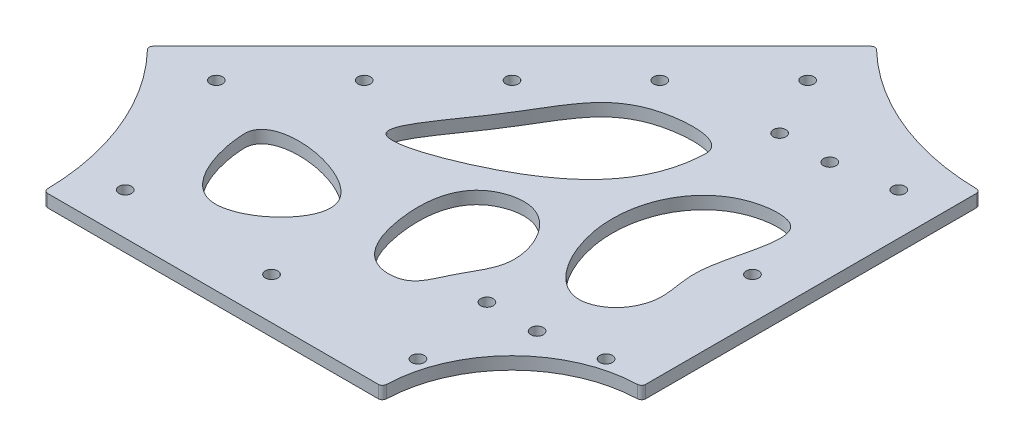
ISO-10303-21;
HEADER;
FILE_DESCRIPTION(('STEP AP214'),'2;1');
FILE_NAME('part.step','',(''),(''),'','','');
FILE_SCHEMA(('AUTOMOTIVE_DESIGN { 1 0 10303 214 1 1 1 1 }'));
ENDSEC;
DATA;
#1=APPLICATION_CONTEXT('core data for automotive mechanical design processes');
#2=APPLICATION_PROTOCOL_DEFINITION('international standard','automotive_design',2000,#1);
#3=PRODUCT_CONTEXT('',#1,'mechanical');
#4=PRODUCT('Part','Part','',(#3));
#5=PRODUCT_RELATED_PRODUCT_CATEGORY('part','',(#4));
#6=PRODUCT_DEFINITION_FORMATION('','',#4);
#7=PRODUCT_DEFINITION_CONTEXT('part definition',#1,'design');
#8=PRODUCT_DEFINITION('design','',#6,#7);
#9=PRODUCT_DEFINITION_SHAPE('','',#8);
#10=(LENGTH_UNIT() NAMED_UNIT(*) SI_UNIT(.MILLI.,.METRE.));
#11=(NAMED_UNIT(*) PLANE_ANGLE_UNIT() SI_UNIT($,.RADIAN.));
#12=(NAMED_UNIT(*) SI_UNIT($,.STERADIAN.) SOLID_ANGLE_UNIT());
#13=UNCERTAINTY_MEASURE_WITH_UNIT(LENGTH_MEASURE(1.E-05),#10,'distance_accuracy_value','');
#14=(GEOMETRIC_REPRESENTATION_CONTEXT(3) GLOBAL_UNCERTAINTY_ASSIGNED_CONTEXT((#13)) GLOBAL_UNIT_ASSIGNED_CONTEXT((#10,
#11,#12)) REPRESENTATION_CONTEXT('',''));
#15=CARTESIAN_POINT('',(0.,0.,0.));
#16=DIRECTION('',(0.,0.,1.));
#17=DIRECTION('',(1.,0.,0.));
#18=AXIS2_PLACEMENT_3D('',#15,#16,#17);
#19=CARTESIAN_POINT('',(-24.142135623731,3.,10.));
#20=DIRECTION('',(0.,0.,-1.));
#21=DIRECTION('',(-1.,0.,0.));
#22=AXIS2_PLACEMENT_3D('',#19,#20,#21);
#23=PLANE('',#22);
#24=DIRECTION('',(1.,0.,0.));
#25=VECTOR('',#24,1.);
#26=CARTESIAN_POINT('',(-24.142135623731,3.,10.));
#27=LINE('',#26,#25);
#28=CARTESIAN_POINT('',(36.8496671041767,3.,10.));
#29=VERTEX_POINT('',#28);
#30=CARTESIAN_POINT('',(115.901451147938,3.,10.));
#31=VERTEX_POINT('',#30);
#32=EDGE_CURVE('E155',#29,#31,#27,.T.);
#33=ORIENTED_EDGE('',*,*,#32,.F.);
#34=DIRECTION('',(0.,1.,0.));
#35=VECTOR('',#34,1.);
#36=CARTESIAN_POINT('',(36.8496671041767,3.,10.));
#37=LINE('',#36,#35);
#38=CARTESIAN_POINT('',(36.8496671041767,0.,10.));
#39=VERTEX_POINT('',#38);
#40=EDGE_CURVE('E196',#29,#39,#37,.F.);
#41=ORIENTED_EDGE('',*,*,#40,.T.);
#42=DIRECTION('',(1.,0.,0.));
#43=VECTOR('',#42,1.);
#44=CARTESIAN_POINT('',(-24.142135623731,0.,10.));
#45=LINE('',#44,#43);
#46=CARTESIAN_POINT('',(115.901451147938,0.,10.));
#47=VERTEX_POINT('',#46);
#48=EDGE_CURVE('E152',#39,#47,#45,.T.);
#49=ORIENTED_EDGE('',*,*,#48,.T.);
#50=DIRECTION('',(0.,1.,0.));
#51=VECTOR('',#50,1.);
#52=CARTESIAN_POINT('',(115.901451147938,3.,10.));
#53=LINE('',#52,#51);
#54=EDGE_CURVE('E193',#47,#31,#53,.T.);
#55=ORIENTED_EDGE('',*,*,#54,.T.);
#56=EDGE_LOOP('',(#33,#41,#49,#55));
#57=FACE_BOUND('',#56,.T.);
#58=ADVANCED_FACE('F35',(#57),#23,.F.);
#59=CARTESIAN_POINT('',(147.885822331377,3.,10.));
#60=DIRECTION('',(-1.,0.,0.));
#61=DIRECTION('',(0.,0.,1.));
#62=AXIS2_PLACEMENT_3D('',#59,#60,#61);
#63=PLANE('',#62);
#64=DIRECTION('',(0.,0.,-1.));
#65=VECTOR('',#64,1.);
#66=CARTESIAN_POINT('',(147.885822331377,0.,10.));
#67=LINE('',#66,#65);
#68=CARTESIAN_POINT('',(147.885822331377,0.,-21.9843711834389));
#69=VERTEX_POINT('',#68);
#70=CARTESIAN_POINT('',(147.885822331377,0.,-101.0361552272));
#71=VERTEX_POINT('',#70);
#72=EDGE_CURVE('E140',#69,#71,#67,.T.);
#73=ORIENTED_EDGE('',*,*,#72,.T.);
#74=DIRECTION('',(0.,1.,0.));
#75=VECTOR('',#74,1.);
#76=CARTESIAN_POINT('',(147.885822331377,3.,-101.0361552272));
#77=LINE('',#76,#75);
#78=CARTESIAN_POINT('',(147.885822331377,3.,-101.0361552272));
#79=VERTEX_POINT('',#78);
#80=EDGE_CURVE('E144',#71,#79,#77,.T.);
#81=ORIENTED_EDGE('',*,*,#80,.T.);
#82=DIRECTION('',(0.,0.,-1.));
#83=VECTOR('',#82,1.);
#84=CARTESIAN_POINT('',(147.885822331377,3.,10.));
#85=LINE('',#84,#83);
#86=CARTESIAN_POINT('',(147.885822331377,3.,-21.9843711834389));
#87=VERTEX_POINT('',#86);
#88=EDGE_CURVE('E143',#87,#79,#85,.T.);
#89=ORIENTED_EDGE('',*,*,#88,.F.);
#90=DIRECTION('',(0.,1.,0.));
#91=VECTOR('',#90,1.);
#92=CARTESIAN_POINT('',(147.885822331377,3.,-21.9843711834389));
#93=LINE('',#92,#91);
#94=EDGE_CURVE('E128',#87,#69,#93,.F.);
#95=ORIENTED_EDGE('',*,*,#94,.T.);
#96=EDGE_LOOP('',(#73,#81,#89,#95));
#97=FACE_BOUND('',#96,.T.);
#98=ADVANCED_FACE('F138',(#97),#63,.F.);
#99=CARTESIAN_POINT('',(-24.142135623731,3.,10.));
#100=DIRECTION('',(0.707106781186547,0.,0.707106781186547));
#101=DIRECTION('',(0.707106781186548,0.,-0.707106781186548));
#102=AXIS2_PLACEMENT_3D('',#99,#100,#101);
#103=PLANE('',#102);
#104=DIRECTION('',(-0.707106781186548,0.,0.707106781186548));
#105=VECTOR('',#104,1.);
#106=CARTESIAN_POINT('',(-24.142135623731,3.,10.));
#107=LINE('',#106,#105);
#108=CARTESIAN_POINT('',(104.758105025681,3.,-118.900240649412));
#109=VERTEX_POINT('',#108);
#110=CARTESIAN_POINT('',(18.9855816819647,3.,-33.1277173056956));
#111=VERTEX_POINT('',#110);
#112=EDGE_CURVE('E162',#109,#111,#107,.T.);
#113=ORIENTED_EDGE('',*,*,#112,.F.);
#114=DIRECTION('',(0.,1.,0.));
#115=VECTOR('',#114,1.);
#116=CARTESIAN_POINT('',(104.758105025681,3.,-118.900240649412));
#117=LINE('',#116,#115);
#118=CARTESIAN_POINT('',(104.758105025681,0.,-118.900240649412));
#119=VERTEX_POINT('',#118);
#120=EDGE_CURVE('E190',#109,#119,#117,.F.);
#121=ORIENTED_EDGE('',*,*,#120,.T.);
#122=DIRECTION('',(-0.707106781186548,0.,0.707106781186548));
#123=VECTOR('',#122,1.);
#124=CARTESIAN_POINT('',(-24.142135623731,0.,10.));
#125=LINE('',#124,#123);
#126=CARTESIAN_POINT('',(18.9855816819647,0.,-33.1277173056956));
#127=VERTEX_POINT('',#126);
#128=EDGE_CURVE('E151',#119,#127,#125,.T.);
#129=ORIENTED_EDGE('',*,*,#128,.T.);
#130=DIRECTION('',(0.,1.,0.));
#131=VECTOR('',#130,1.);
#132=CARTESIAN_POINT('',(18.9855816819647,3.,-33.1277173056956));
#133=LINE('',#132,#131);
#134=EDGE_CURVE('E187',#127,#111,#133,.T.);
#135=ORIENTED_EDGE('',*,*,#134,.T.);
#136=EDGE_LOOP('',(#113,#121,#129,#135));
#137=FACE_BOUND('',#136,.T.);
#138=ADVANCED_FACE('F230',(#137),#103,.F.);
#139=CARTESIAN_POINT('',(0.,3.,0.));
#140=DIRECTION('',(0.,1.,0.));
#141=DIRECTION('',(0.,0.,1.));
#142=AXIS2_PLACEMENT_3D('',#139,#140,#141);
#143=PLANE('',#142);
#144=CARTESIAN_POINT('',(48.0207708751559,3.,-26.5380031517667));
#145=CARTESIAN_POINT('',(47.9589380150706,3.,-26.0324703958686));
#146=CARTESIAN_POINT('',(48.2417406627143,3.,-18.7176820810887));
#147=CARTESIAN_POINT('',(55.3857149417099,3.,1.39028527395019));
#148=CARTESIAN_POINT('',(88.3338671294946,3.,-27.3294698025201));
#149=CARTESIAN_POINT('',(48.9933759244344,3.,-34.4898221406404));
#150=CARTESIAN_POINT('',(48.0207708751559,3.,-26.5380031517667));
#151=B_SPLINE_CURVE_WITH_KNOTS('',3,(#144,#145,#146,#147,#148,#149,#150),.UNSPECIFIED.,.T.,.F.,
(4,1,1,1,4),(0.,0.0238617420393639,0.315324429022035,0.62466476950808,1.),.UNSPECIFIED.);
#152=CARTESIAN_POINT('',(48.0207708751559,3.,-26.5380031517667));
#153=VERTEX_POINT('',#152);
#154=EDGE_CURVE('E311',#153,#153,#151,.T.);
#155=ORIENTED_EDGE('',*,*,#154,.F.);
#156=EDGE_LOOP('',(#155));
#157=FACE_BOUND('',#156,.T.);
#158=CARTESIAN_POINT('',(110.008057919536,3.,-47.5424894786678));
#159=CARTESIAN_POINT('',(111.489833592235,3.,-39.2434784078382));
#160=CARTESIAN_POINT('',(118.20161406506,3.,-28.622441594674));
#161=CARTESIAN_POINT('',(129.148102504398,3.,-33.9272325353464));
#162=CARTESIAN_POINT('',(132.873326016814,3.,-41.5995162160901));
#163=CARTESIAN_POINT('',(128.223189281434,3.,-53.7391117008643));
#164=CARTESIAN_POINT('',(138.835243286505,3.,-73.9172414331117));
#165=CARTESIAN_POINT('',(114.902579525797,3.,-73.0151046379616));
#166=CARTESIAN_POINT('',(107.962638199714,3.,-58.9983131988496));
#167=CARTESIAN_POINT('',(110.008057919536,3.,-47.5424894786678));
#168=B_SPLINE_CURVE_WITH_KNOTS('',3,(#158,#159,#160,#161,#162,#163,#164,#165,#166,#167),
.UNSPECIFIED.,.T.,.F.,(4,1,1,1,1,1,1,4),(0.,0.203400882189778,0.252548794532999,
0.328655402043644,0.427644221375782,0.641239676770633,0.719228636881117,1.),.UNSPECIFIED.);
#169=CARTESIAN_POINT('',(110.008057919536,3.,-47.5424894786678));
#170=VERTEX_POINT('',#169);
#171=EDGE_CURVE('E330',#170,#170,#168,.T.);
#172=ORIENTED_EDGE('',*,*,#171,.F.);
#173=EDGE_LOOP('',(#172));
#174=FACE_BOUND('',#173,.T.);
#175=CARTESIAN_POINT('',(88.2604406907473,3.,-42.6926426949315));
#176=CARTESIAN_POINT('',(84.0615771036215,3.,-39.2650824081983));
#177=CARTESIAN_POINT('',(82.780161964088,3.,-27.5588647487042));
#178=CARTESIAN_POINT('',(88.002608571192,3.,-13.5928161103983));
#179=CARTESIAN_POINT('',(99.2211157214691,3.,-14.151818351598));
#180=CARTESIAN_POINT('',(102.059809278584,3.,-22.5705701118098));
#181=CARTESIAN_POINT('',(109.056863231587,3.,-31.6477895194941));
#182=CARTESIAN_POINT('',(101.312029856873,3.,-47.6269058760816));
#183=CARTESIAN_POINT('',(90.8944301674383,3.,-44.842785832151));
#184=CARTESIAN_POINT('',(88.2604406907473,3.,-42.6926426949315));
#185=B_SPLINE_CURVE_WITH_KNOTS('',3,(#175,#176,#177,#178,#179,#180,#181,#182,#183,#184),
.UNSPECIFIED.,.T.,.F.,(4,1,1,1,1,1,1,4),(0.,0.20020163156701,0.380411687288089,
0.454336448949224,0.547770151120612,0.674620485174556,0.874411497344012,1.),.UNSPECIFIED.);
#186=CARTESIAN_POINT('',(88.2604406907473,3.,-42.6926426949315));
#187=VERTEX_POINT('',#186);
#188=EDGE_CURVE('E312',#187,#187,#185,.T.);
#189=ORIENTED_EDGE('',*,*,#188,.F.);
#190=EDGE_LOOP('',(#189));
#191=FACE_BOUND('',#190,.T.);
#192=CARTESIAN_POINT('',(107.258933635174,3.,-77.3439365042997));
#193=CARTESIAN_POINT('',(106.861115496115,3.,-81.4499527020187));
#194=CARTESIAN_POINT('',(84.1430807750505,3.,-81.6117622461612));
#195=CARTESIAN_POINT('',(79.1212888398042,3.,-64.9228780353873));
#196=CARTESIAN_POINT('',(56.6410949038031,3.,-37.2502898617927));
#197=CARTESIAN_POINT('',(94.5137998700881,3.,-50.1673077245055));
#198=CARTESIAN_POINT('',(106.828330692644,3.,-64.1568131094747));
#199=CARTESIAN_POINT('',(107.292522099081,3.,-76.9972585544591));
#200=CARTESIAN_POINT('',(107.258933635174,3.,-77.3439365042997));
#201=B_SPLINE_CURVE_WITH_KNOTS('',3,(#192,#193,#194,#195,#196,#197,#198,#199,#200),
.UNSPECIFIED.,.T.,.F.,(4,1,1,1,1,1,4),(0.,0.108879833934048,0.352646080529844,0.515155306572242,
0.685720332886159,0.990807089940803,1.),.UNSPECIFIED.);
#202=CARTESIAN_POINT('',(107.258933635174,3.,-77.3439365042997));
#203=VERTEX_POINT('',#202);
#204=EDGE_CURVE('E310',#203,#203,#201,.T.);
#205=ORIENTED_EDGE('',*,*,#204,.F.);
#206=EDGE_LOOP('',(#205));
#207=FACE_BOUND('',#206,.T.);
#208=CARTESIAN_POINT('',(137.885822331377,3.,-22.5));
#209=DIRECTION('',(0.,1.,0.));
#210=DIRECTION('',(0.,0.,-1.));
#211=AXIS2_PLACEMENT_3D('',#208,#209,#210);
#212=CIRCLE('',#211,1.5);
#213=CARTESIAN_POINT('',(137.885822331377,3.,-24.));
#214=VERTEX_POINT('',#213);
#215=EDGE_CURVE('E695',#214,#214,#212,.T.);
#216=ORIENTED_EDGE('',*,*,#215,.F.);
#217=EDGE_LOOP('',(#216));
#218=FACE_BOUND('',#217,.T.);
#219=CARTESIAN_POINT('',(104.298250225016,3.,-104.298250225016));
#220=DIRECTION('',(0.,1.,0.));
#221=DIRECTION('',(0.,0.,1.));
#222=AXIS2_PLACEMENT_3D('',#219,#220,#221);
#223=CIRCLE('',#222,1.50000000000001);
#224=CARTESIAN_POINT('',(104.298250225016,3.,-102.798250225016));
#225=VERTEX_POINT('',#224);
#226=EDGE_CURVE('E726',#225,#225,#223,.T.);
#227=ORIENTED_EDGE('',*,*,#226,.F.);
#228=EDGE_LOOP('',(#227));
#229=FACE_BOUND('',#228,.T.);
#230=CARTESIAN_POINT('',(86.620580695352,3.,-86.620580695352));
#231=DIRECTION('',(0.,1.,0.));
#232=DIRECTION('',(0.,0.,1.));
#233=AXIS2_PLACEMENT_3D('',#230,#231,#232);
#234=CIRCLE('',#233,1.50000000000001);
#235=CARTESIAN_POINT('',(86.620580695352,3.,-85.120580695352));
#236=VERTEX_POINT('',#235);
#237=EDGE_CURVE('E722',#236,#236,#234,.T.);
#238=ORIENTED_EDGE('',*,*,#237,.F.);
#239=EDGE_LOOP('',(#238));
#240=FACE_BOUND('',#239,.T.);
#241=CARTESIAN_POINT('',(68.9429111656883,3.,-68.9429111656883));
#242=DIRECTION('',(0.,1.,0.));
#243=DIRECTION('',(0.,0.,1.));
#244=AXIS2_PLACEMENT_3D('',#241,#242,#243);
#245=CIRCLE('',#244,1.50000000000001);
#246=CARTESIAN_POINT('',(68.9429111656883,3.,-67.4429111656883));
#247=VERTEX_POINT('',#246);
#248=EDGE_CURVE('E718',#247,#247,#245,.T.);
#249=ORIENTED_EDGE('',*,*,#248,.F.);
#250=EDGE_LOOP('',(#249));
#251=FACE_BOUND('',#250,.T.);
#252=CARTESIAN_POINT('',(51.2652416360246,3.,-51.2652416360247));
#253=DIRECTION('',(0.,1.,0.));
#254=DIRECTION('',(0.,0.,1.));
#255=AXIS2_PLACEMENT_3D('',#252,#253,#254);
#256=CIRCLE('',#255,1.50000000000001);
#257=CARTESIAN_POINT('',(51.2652416360246,3.,-49.7652416360247));
#258=VERTEX_POINT('',#257);
#259=EDGE_CURVE('E253',#258,#258,#256,.T.);
#260=ORIENTED_EDGE('',*,*,#259,.F.);
#261=EDGE_LOOP('',(#260));
#262=FACE_BOUND('',#261,.T.);
#263=CARTESIAN_POINT('',(33.5875721063609,3.,-33.587572106361));
#264=DIRECTION('',(0.,1.,0.));
#265=DIRECTION('',(0.,0.,1.));
#266=AXIS2_PLACEMENT_3D('',#263,#264,#265);
#267=CIRCLE('',#266,1.5);
#268=CARTESIAN_POINT('',(33.5875721063609,3.,-32.087572106361));
#269=VERTEX_POINT('',#268);
#270=EDGE_CURVE('E739',#269,#269,#267,.T.);
#271=ORIENTED_EDGE('',*,*,#270,.F.);
#272=EDGE_LOOP('',(#271));
#273=FACE_BOUND('',#272,.T.);
#274=CARTESIAN_POINT('',(45.3858223313768,3.,4.92276834389992E-13));
#275=DIRECTION('',(0.,1.,0.));
#276=DIRECTION('',(0.,0.,1.));
#277=AXIS2_PLACEMENT_3D('',#274,#275,#276);
#278=CIRCLE('',#277,1.5);
#279=CARTESIAN_POINT('',(45.3858223313768,3.,1.50000000000049));
#280=VERTEX_POINT('',#279);
#281=EDGE_CURVE('E735',#280,#280,#278,.T.);
#282=ORIENTED_EDGE('',*,*,#281,.F.);
#283=EDGE_LOOP('',(#282));
#284=FACE_BOUND('',#283,.T.);
#285=CARTESIAN_POINT('',(80.3858223313768,3.,2.47873140670973E-13));
#286=DIRECTION('',(0.,1.,0.));
#287=DIRECTION('',(0.,0.,1.));
#288=AXIS2_PLACEMENT_3D('',#285,#286,#287);
#289=CIRCLE('',#288,1.5);
#290=CARTESIAN_POINT('',(80.3858223313768,3.,1.50000000000025));
#291=VERTEX_POINT('',#290);
#292=EDGE_CURVE('E731',#291,#291,#289,.T.);
#293=ORIENTED_EDGE('',*,*,#292,.F.);
#294=EDGE_LOOP('',(#293));
#295=FACE_BOUND('',#294,.T.);
#296=CARTESIAN_POINT('',(123.885822331377,3.,-20.));
#297=DIRECTION('',(0.,1.,0.));
#298=DIRECTION('',(0.,0.,-1.));
#299=AXIS2_PLACEMENT_3D('',#296,#297,#298);
#300=CIRCLE('',#299,1.50000000000001);
#301=CARTESIAN_POINT('',(123.885822331377,3.,-21.5));
#302=VERTEX_POINT('',#301);
#303=EDGE_CURVE('E348',#302,#302,#300,.T.);
#304=ORIENTED_EDGE('',*,*,#303,.F.);
#305=EDGE_LOOP('',(#304));
#306=FACE_BOUND('',#305,.T.);
#307=CARTESIAN_POINT('',(123.885822331377,3.,-90.));
#308=DIRECTION('',(0.,1.,0.));
#309=DIRECTION('',(0.,0.,-1.));
#310=AXIS2_PLACEMENT_3D('',#307,#308,#309);
#311=CIRCLE('',#310,1.49999999999999);
#312=CARTESIAN_POINT('',(123.885822331377,3.,-91.5));
#313=VERTEX_POINT('',#312);
#314=EDGE_CURVE('E758',#313,#313,#311,.T.);
#315=ORIENTED_EDGE('',*,*,#314,.F.);
#316=EDGE_LOOP('',(#315));
#317=FACE_BOUND('',#316,.T.);
#318=CARTESIAN_POINT('',(111.885822331377,3.,-20.));
#319=DIRECTION('',(0.,1.,0.));
#320=DIRECTION('',(0.,0.,1.));
#321=AXIS2_PLACEMENT_3D('',#318,#319,#320);
#322=CIRCLE('',#321,1.5);
#323=CARTESIAN_POINT('',(111.885822331377,3.,-18.5));
#324=VERTEX_POINT('',#323);
#325=EDGE_CURVE('E714',#324,#324,#322,.T.);
#326=ORIENTED_EDGE('',*,*,#325,.F.);
#327=EDGE_LOOP('',(#326));
#328=FACE_BOUND('',#327,.T.);
#329=CARTESIAN_POINT('',(111.885822331377,3.,-90.));
#330=DIRECTION('',(0.,1.,0.));
#331=DIRECTION('',(0.,0.,1.));
#332=AXIS2_PLACEMENT_3D('',#329,#330,#331);
#333=CIRCLE('',#332,1.5);
#334=CARTESIAN_POINT('',(111.885822331377,3.,-88.5));
#335=VERTEX_POINT('',#334);
#336=EDGE_CURVE('E710',#335,#335,#333,.T.);
#337=ORIENTED_EDGE('',*,*,#336,.F.);
#338=EDGE_LOOP('',(#337));
#339=FACE_BOUND('',#338,.T.);
#340=CARTESIAN_POINT('',(137.885822331377,3.,-92.5));
#341=DIRECTION('',(0.,1.,0.));
#342=DIRECTION('',(0.,0.,-1.));
#343=AXIS2_PLACEMENT_3D('',#340,#341,#342);
#344=CIRCLE('',#343,1.50000000000002);
#345=CARTESIAN_POINT('',(137.885822331377,3.,-94.0000000000001));
#346=VERTEX_POINT('',#345);
#347=EDGE_CURVE('E706',#346,#346,#344,.T.);
#348=ORIENTED_EDGE('',*,*,#347,.F.);
#349=EDGE_LOOP('',(#348));
#350=FACE_BOUND('',#349,.T.);
#351=CARTESIAN_POINT('',(137.885822331377,3.,-57.5));
#352=DIRECTION('',(0.,1.,0.));
#353=DIRECTION('',(0.,0.,-1.));
#354=AXIS2_PLACEMENT_3D('',#351,#352,#353);
#355=CIRCLE('',#354,1.50000000000001);
#356=CARTESIAN_POINT('',(137.885822331377,3.,-59.));
#357=VERTEX_POINT('',#356);
#358=EDGE_CURVE('E696',#357,#357,#355,.T.);
#359=ORIENTED_EDGE('',*,*,#358,.F.);
#360=EDGE_LOOP('',(#359));
#361=FACE_BOUND('',#360,.T.);
#362=CARTESIAN_POINT('',(115.385822331377,3.,0.));
#363=DIRECTION('',(0.,1.,0.));
#364=DIRECTION('',(0.,0.,1.));
#365=AXIS2_PLACEMENT_3D('',#362,#363,#364);
#366=CIRCLE('',#365,1.5);
#367=CARTESIAN_POINT('',(115.385822331377,3.,1.5));
#368=VERTEX_POINT('',#367);
#369=EDGE_CURVE('E245',#368,#368,#366,.T.);
#370=ORIENTED_EDGE('',*,*,#369,.F.);
#371=EDGE_LOOP('',(#370));
#372=FACE_BOUND('',#371,.T.);
#373=ORIENTED_EDGE('',*,*,#88,.T.);
#374=CARTESIAN_POINT('',(146.885822331377,3.,-101.0361552272));
#375=DIRECTION('',(0.,1.,0.));
#376=DIRECTION('',(0.,0.,1.));
#377=AXIS2_PLACEMENT_3D('',#374,#375,#376);
#378=CIRCLE('',#377,1.);
#379=CARTESIAN_POINT('',(146.902215774,3.,-102.03602084569));
#380=VERTEX_POINT('',#379);
#381=EDGE_CURVE('E175',#79,#380,#378,.T.);
#382=ORIENTED_EDGE('',*,*,#381,.T.);
#383=CARTESIAN_POINT('',(147.885822331377,3.,-162.027957955108));
#384=DIRECTION('',(0.,1.,0.));
#385=DIRECTION('',(0.,0.,1.));
#386=AXIS2_PLACEMENT_3D('',#383,#384,#385);
#387=CIRCLE('',#386,60.);
#388=CARTESIAN_POINT('',(106.160631651532,3.,-118.911737541781));
#389=VERTEX_POINT('',#388);
#390=EDGE_CURVE('E158',#389,#380,#387,.T.);
#391=ORIENTED_EDGE('',*,*,#390,.F.);
#392=CARTESIAN_POINT('',(105.465211806868,3.,-118.193133868226));
#393=DIRECTION('',(0.,1.,0.));
#394=DIRECTION('',(0.,0.,1.));
#395=AXIS2_PLACEMENT_3D('',#392,#393,#394);
#396=CIRCLE('',#395,1.);
#397=EDGE_CURVE('E173',#389,#109,#396,.T.);
#398=ORIENTED_EDGE('',*,*,#397,.T.);
#399=ORIENTED_EDGE('',*,*,#112,.T.);
#400=CARTESIAN_POINT('',(19.6926884631512,3.,-32.4206105245091));
#401=DIRECTION('',(0.,1.,0.));
#402=DIRECTION('',(0.,0.,1.));
#403=AXIS2_PLACEMENT_3D('',#400,#401,#402);
#404=CIRCLE('',#403,1.);
#405=CARTESIAN_POINT('',(18.9740847895958,3.,-31.725190679845));
#406=VERTEX_POINT('',#405);
#407=EDGE_CURVE('E169',#111,#406,#404,.T.);
#408=ORIENTED_EDGE('',*,*,#407,.T.);
#409=CARTESIAN_POINT('',(-24.142135623731,3.,10.));
#410=DIRECTION('',(0.,1.,0.));
#411=DIRECTION('',(0.,0.,1.));
#412=AXIS2_PLACEMENT_3D('',#409,#410,#411);
#413=CIRCLE('',#412,60.);
#414=CARTESIAN_POINT('',(35.8498014856864,3.,9.01639344262295));
#415=VERTEX_POINT('',#414);
#416=EDGE_CURVE('E210',#415,#406,#413,.T.);
#417=ORIENTED_EDGE('',*,*,#416,.F.);
#418=CARTESIAN_POINT('',(36.8496671041767,3.,9.));
#419=DIRECTION('',(0.,1.,0.));
#420=DIRECTION('',(0.,0.,1.));
#421=AXIS2_PLACEMENT_3D('',#418,#419,#420);
#422=CIRCLE('',#421,1.);
#423=EDGE_CURVE('E171',#415,#29,#422,.T.);
#424=ORIENTED_EDGE('',*,*,#423,.T.);
#425=ORIENTED_EDGE('',*,*,#32,.T.);
#426=CARTESIAN_POINT('',(115.901451147938,3.,9.));
#427=DIRECTION('',(0.,1.,0.));
#428=DIRECTION('',(0.,0.,1.));
#429=AXIS2_PLACEMENT_3D('',#426,#427,#428);
#430=CIRCLE('',#429,1.);
#431=CARTESIAN_POINT('',(116.90096274742,3.,9.03125));
#432=VERTEX_POINT('',#431);
#433=EDGE_CURVE('E165',#31,#432,#430,.T.);
#434=ORIENTED_EDGE('',*,*,#433,.T.);
#435=CARTESIAN_POINT('',(147.885822331377,3.,10.));
#436=DIRECTION('',(0.,1.,0.));
#437=DIRECTION('',(0.,0.,1.));
#438=AXIS2_PLACEMENT_3D('',#435,#436,#437);
#439=CIRCLE('',#438,31.);
#440=CARTESIAN_POINT('',(146.917072331377,3.,-20.9848595839565));
#441=VERTEX_POINT('',#440);
#442=EDGE_CURVE('E207',#441,#432,#439,.T.);
#443=ORIENTED_EDGE('',*,*,#442,.F.);
#444=CARTESIAN_POINT('',(146.885822331377,3.,-21.9843711834389));
#445=DIRECTION('',(0.,1.,0.));
#446=DIRECTION('',(0.,0.,1.));
#447=AXIS2_PLACEMENT_3D('',#444,#445,#446);
#448=CIRCLE('',#447,1.);
#449=EDGE_CURVE('E167',#441,#87,#448,.T.);
#450=ORIENTED_EDGE('',*,*,#449,.T.);
#451=EDGE_LOOP('',(#373,#382,#391,#398,#399,#408,#417,#424,#425,#434,#443,#450));
#452=FACE_BOUND('',#451,.T.);
#453=ADVANCED_FACE('F218',(#157,#174,#191,#207,#218,#229,#240,#251,#262,#273,#284,#295,#306,
#317,#328,#339,#350,#361,#372,#452),#143,.T.);
#454=CARTESIAN_POINT('',(0.,0.,0.));
#455=DIRECTION('',(0.,1.,0.));
#456=DIRECTION('',(0.,0.,1.));
#457=AXIS2_PLACEMENT_3D('',#454,#455,#456);
#458=PLANE('',#457);
#459=CARTESIAN_POINT('',(48.0207708751559,0.,-26.5380031517667));
#460=CARTESIAN_POINT('',(47.9589380150706,0.,-26.0324703958686));
#461=CARTESIAN_POINT('',(48.2417406627143,0.,-18.7176820810887));
#462=CARTESIAN_POINT('',(55.3857149417099,0.,1.39028527395019));
#463=CARTESIAN_POINT('',(88.3338671294946,0.,-27.3294698025201));
#464=CARTESIAN_POINT('',(48.9933759244344,0.,-34.4898221406404));
#465=CARTESIAN_POINT('',(48.0207708751559,0.,-26.5380031517667));
#466=B_SPLINE_CURVE_WITH_KNOTS('',3,(#459,#460,#461,#462,#463,#464,#465),.UNSPECIFIED.,.T.,.F.,
(4,1,1,1,4),(0.,0.0238617420393639,0.315324429022035,0.62466476950808,1.),.UNSPECIFIED.);
#467=CARTESIAN_POINT('',(48.0207708751559,0.,-26.5380031517667));
#468=VERTEX_POINT('',#467);
#469=EDGE_CURVE('E303',#468,#468,#466,.T.);
#470=ORIENTED_EDGE('',*,*,#469,.T.);
#471=EDGE_LOOP('',(#470));
#472=FACE_BOUND('',#471,.T.);
#473=CARTESIAN_POINT('',(110.008057919536,0.,-47.5424894786678));
#474=CARTESIAN_POINT('',(111.489833592235,0.,-39.2434784078382));
#475=CARTESIAN_POINT('',(118.20161406506,0.,-28.622441594674));
#476=CARTESIAN_POINT('',(129.148102504398,0.,-33.9272325353464));
#477=CARTESIAN_POINT('',(132.873326016814,0.,-41.5995162160901));
#478=CARTESIAN_POINT('',(128.223189281434,0.,-53.7391117008643));
#479=CARTESIAN_POINT('',(138.835243286505,0.,-73.9172414331117));
#480=CARTESIAN_POINT('',(114.902579525797,0.,-73.0151046379616));
#481=CARTESIAN_POINT('',(107.962638199714,0.,-58.9983131988496));
#482=CARTESIAN_POINT('',(110.008057919536,0.,-47.5424894786678));
#483=B_SPLINE_CURVE_WITH_KNOTS('',3,(#473,#474,#475,#476,#477,#478,#479,#480,#481,#482),
.UNSPECIFIED.,.T.,.F.,(4,1,1,1,1,1,1,4),(0.,0.203400882189778,0.252548794532999,
0.328655402043644,0.427644221375782,0.641239676770633,0.719228636881117,1.),.UNSPECIFIED.);
#484=CARTESIAN_POINT('',(110.008057919536,0.,-47.5424894786678));
#485=VERTEX_POINT('',#484);
#486=EDGE_CURVE('E321',#485,#485,#483,.T.);
#487=ORIENTED_EDGE('',*,*,#486,.T.);
#488=EDGE_LOOP('',(#487));
#489=FACE_BOUND('',#488,.T.);
#490=CARTESIAN_POINT('',(88.2604406907473,0.,-42.6926426949315));
#491=CARTESIAN_POINT('',(84.0615771036215,0.,-39.2650824081983));
#492=CARTESIAN_POINT('',(82.780161964088,0.,-27.5588647487042));
#493=CARTESIAN_POINT('',(88.002608571192,0.,-13.5928161103983));
#494=CARTESIAN_POINT('',(99.2211157214691,0.,-14.151818351598));
#495=CARTESIAN_POINT('',(102.059809278584,0.,-22.5705701118098));
#496=CARTESIAN_POINT('',(109.056863231587,0.,-31.6477895194941));
#497=CARTESIAN_POINT('',(101.312029856873,0.,-47.6269058760816));
#498=CARTESIAN_POINT('',(90.8944301674383,0.,-44.842785832151));
#499=CARTESIAN_POINT('',(88.2604406907473,0.,-42.6926426949315));
#500=B_SPLINE_CURVE_WITH_KNOTS('',3,(#490,#491,#492,#493,#494,#495,#496,#497,#498,#499),
.UNSPECIFIED.,.T.,.F.,(4,1,1,1,1,1,1,4),(0.,0.20020163156701,0.380411687288089,
0.454336448949224,0.547770151120612,0.674620485174556,0.874411497344012,1.),.UNSPECIFIED.);
#501=CARTESIAN_POINT('',(88.2604406907473,0.,-42.6926426949315));
#502=VERTEX_POINT('',#501);
#503=EDGE_CURVE('E338',#502,#502,#500,.T.);
#504=ORIENTED_EDGE('',*,*,#503,.T.);
#505=EDGE_LOOP('',(#504));
#506=FACE_BOUND('',#505,.T.);
#507=CARTESIAN_POINT('',(107.258933635174,0.,-77.3439365042997));
#508=CARTESIAN_POINT('',(106.861115496115,0.,-81.4499527020187));
#509=CARTESIAN_POINT('',(84.1430807750505,0.,-81.6117622461612));
#510=CARTESIAN_POINT('',(79.1212888398042,0.,-64.9228780353873));
#511=CARTESIAN_POINT('',(56.6410949038031,0.,-37.2502898617927));
#512=CARTESIAN_POINT('',(94.5137998700881,0.,-50.1673077245055));
#513=CARTESIAN_POINT('',(106.828330692644,0.,-64.1568131094747));
#514=CARTESIAN_POINT('',(107.292522099081,0.,-76.9972585544591));
#515=CARTESIAN_POINT('',(107.258933635174,0.,-77.3439365042997));
#516=B_SPLINE_CURVE_WITH_KNOTS('',3,(#507,#508,#509,#510,#511,#512,#513,#514,#515),
.UNSPECIFIED.,.T.,.F.,(4,1,1,1,1,1,4),(0.,0.108879833934048,0.352646080529844,0.515155306572242,
0.685720332886159,0.990807089940803,1.),.UNSPECIFIED.);
#517=CARTESIAN_POINT('',(107.258933635174,0.,-77.3439365042997));
#518=VERTEX_POINT('',#517);
#519=EDGE_CURVE('E339',#518,#518,#516,.T.);
#520=ORIENTED_EDGE('',*,*,#519,.T.);
#521=EDGE_LOOP('',(#520));
#522=FACE_BOUND('',#521,.T.);
#523=CARTESIAN_POINT('',(137.885822331377,0.,-22.5));
#524=DIRECTION('',(0.,1.,0.));
#525=DIRECTION('',(0.,0.,-1.));
#526=AXIS2_PLACEMENT_3D('',#523,#524,#525);
#527=CIRCLE('',#526,1.5);
#528=CARTESIAN_POINT('',(137.885822331377,0.,-24.));
#529=VERTEX_POINT('',#528);
#530=EDGE_CURVE('E644',#529,#529,#527,.T.);
#531=ORIENTED_EDGE('',*,*,#530,.T.);
#532=EDGE_LOOP('',(#531));
#533=FACE_BOUND('',#532,.T.);
#534=CARTESIAN_POINT('',(104.298250225016,0.,-104.298250225016));
#535=DIRECTION('',(0.,1.,0.));
#536=DIRECTION('',(0.,0.,1.));
#537=AXIS2_PLACEMENT_3D('',#534,#535,#536);
#538=CIRCLE('',#537,1.50000000000001);
#539=CARTESIAN_POINT('',(104.298250225016,0.,-102.798250225016));
#540=VERTEX_POINT('',#539);
#541=EDGE_CURVE('E648',#540,#540,#538,.T.);
#542=ORIENTED_EDGE('',*,*,#541,.T.);
#543=EDGE_LOOP('',(#542));
#544=FACE_BOUND('',#543,.T.);
#545=CARTESIAN_POINT('',(86.620580695352,0.,-86.620580695352));
#546=DIRECTION('',(0.,1.,0.));
#547=DIRECTION('',(0.,0.,1.));
#548=AXIS2_PLACEMENT_3D('',#545,#546,#547);
#549=CIRCLE('',#548,1.50000000000001);
#550=CARTESIAN_POINT('',(86.620580695352,0.,-85.120580695352));
#551=VERTEX_POINT('',#550);
#552=EDGE_CURVE('E652',#551,#551,#549,.T.);
#553=ORIENTED_EDGE('',*,*,#552,.T.);
#554=EDGE_LOOP('',(#553));
#555=FACE_BOUND('',#554,.T.);
#556=CARTESIAN_POINT('',(68.9429111656883,0.,-68.9429111656883));
#557=DIRECTION('',(0.,1.,0.));
#558=DIRECTION('',(0.,0.,1.));
#559=AXIS2_PLACEMENT_3D('',#556,#557,#558);
#560=CIRCLE('',#559,1.50000000000001);
#561=CARTESIAN_POINT('',(68.9429111656883,0.,-67.4429111656883));
#562=VERTEX_POINT('',#561);
#563=EDGE_CURVE('E656',#562,#562,#560,.T.);
#564=ORIENTED_EDGE('',*,*,#563,.T.);
#565=EDGE_LOOP('',(#564));
#566=FACE_BOUND('',#565,.T.);
#567=CARTESIAN_POINT('',(51.2652416360246,0.,-51.2652416360247));
#568=DIRECTION('',(0.,1.,0.));
#569=DIRECTION('',(0.,0.,1.));
#570=AXIS2_PLACEMENT_3D('',#567,#568,#569);
#571=CIRCLE('',#570,1.50000000000001);
#572=CARTESIAN_POINT('',(51.2652416360246,0.,-49.7652416360247));
#573=VERTEX_POINT('',#572);
#574=EDGE_CURVE('E660',#573,#573,#571,.T.);
#575=ORIENTED_EDGE('',*,*,#574,.T.);
#576=EDGE_LOOP('',(#575));
#577=FACE_BOUND('',#576,.T.);
#578=CARTESIAN_POINT('',(33.5875721063609,0.,-33.587572106361));
#579=DIRECTION('',(0.,1.,0.));
#580=DIRECTION('',(0.,0.,1.));
#581=AXIS2_PLACEMENT_3D('',#578,#579,#580);
#582=CIRCLE('',#581,1.5);
#583=CARTESIAN_POINT('',(33.5875721063609,0.,-32.087572106361));
#584=VERTEX_POINT('',#583);
#585=EDGE_CURVE('E664',#584,#584,#582,.T.);
#586=ORIENTED_EDGE('',*,*,#585,.T.);
#587=EDGE_LOOP('',(#586));
#588=FACE_BOUND('',#587,.T.);
#589=CARTESIAN_POINT('',(45.3858223313768,0.,4.92276834389992E-13));
#590=DIRECTION('',(0.,1.,0.));
#591=DIRECTION('',(0.,0.,1.));
#592=AXIS2_PLACEMENT_3D('',#589,#590,#591);
#593=CIRCLE('',#592,1.5);
#594=CARTESIAN_POINT('',(45.3858223313768,0.,1.50000000000049));
#595=VERTEX_POINT('',#594);
#596=EDGE_CURVE('E668',#595,#595,#593,.T.);
#597=ORIENTED_EDGE('',*,*,#596,.T.);
#598=EDGE_LOOP('',(#597));
#599=FACE_BOUND('',#598,.T.);
#600=CARTESIAN_POINT('',(80.3858223313768,0.,2.47873140670973E-13));
#601=DIRECTION('',(0.,1.,0.));
#602=DIRECTION('',(0.,0.,1.));
#603=AXIS2_PLACEMENT_3D('',#600,#601,#602);
#604=CIRCLE('',#603,1.5);
#605=CARTESIAN_POINT('',(80.3858223313768,0.,1.50000000000025));
#606=VERTEX_POINT('',#605);
#607=EDGE_CURVE('E250',#606,#606,#604,.T.);
#608=ORIENTED_EDGE('',*,*,#607,.T.);
#609=EDGE_LOOP('',(#608));
#610=FACE_BOUND('',#609,.T.);
#611=CARTESIAN_POINT('',(123.885822331377,0.,-20.));
#612=DIRECTION('',(0.,1.,0.));
#613=DIRECTION('',(0.,0.,-1.));
#614=AXIS2_PLACEMENT_3D('',#611,#612,#613);
#615=CIRCLE('',#614,1.50000000000001);
#616=CARTESIAN_POINT('',(123.885822331377,0.,-21.5));
#617=VERTEX_POINT('',#616);
#618=EDGE_CURVE('E675',#617,#617,#615,.T.);
#619=ORIENTED_EDGE('',*,*,#618,.T.);
#620=EDGE_LOOP('',(#619));
#621=FACE_BOUND('',#620,.T.);
#622=CARTESIAN_POINT('',(123.885822331377,0.,-90.));
#623=DIRECTION('',(0.,1.,0.));
#624=DIRECTION('',(0.,0.,-1.));
#625=AXIS2_PLACEMENT_3D('',#622,#623,#624);
#626=CIRCLE('',#625,1.49999999999999);
#627=CARTESIAN_POINT('',(123.885822331377,0.,-91.5));
#628=VERTEX_POINT('',#627);
#629=EDGE_CURVE('E679',#628,#628,#626,.T.);
#630=ORIENTED_EDGE('',*,*,#629,.T.);
#631=EDGE_LOOP('',(#630));
#632=FACE_BOUND('',#631,.T.);
#633=CARTESIAN_POINT('',(111.885822331377,0.,-20.));
#634=DIRECTION('',(0.,1.,0.));
#635=DIRECTION('',(0.,0.,1.));
#636=AXIS2_PLACEMENT_3D('',#633,#634,#635);
#637=CIRCLE('',#636,1.5);
#638=CARTESIAN_POINT('',(111.885822331377,0.,-18.5));
#639=VERTEX_POINT('',#638);
#640=EDGE_CURVE('E683',#639,#639,#637,.T.);
#641=ORIENTED_EDGE('',*,*,#640,.T.);
#642=EDGE_LOOP('',(#641));
#643=FACE_BOUND('',#642,.T.);
#644=CARTESIAN_POINT('',(111.885822331377,0.,-90.));
#645=DIRECTION('',(0.,1.,0.));
#646=DIRECTION('',(0.,0.,1.));
#647=AXIS2_PLACEMENT_3D('',#644,#645,#646);
#648=CIRCLE('',#647,1.5);
#649=CARTESIAN_POINT('',(111.885822331377,0.,-88.5));
#650=VERTEX_POINT('',#649);
#651=EDGE_CURVE('E687',#650,#650,#648,.T.);
#652=ORIENTED_EDGE('',*,*,#651,.T.);
#653=EDGE_LOOP('',(#652));
#654=FACE_BOUND('',#653,.T.);
#655=CARTESIAN_POINT('',(137.885822331377,0.,-92.5));
#656=DIRECTION('',(0.,1.,0.));
#657=DIRECTION('',(0.,0.,-1.));
#658=AXIS2_PLACEMENT_3D('',#655,#656,#657);
#659=CIRCLE('',#658,1.50000000000002);
#660=CARTESIAN_POINT('',(137.885822331377,0.,-94.0000000000001));
#661=VERTEX_POINT('',#660);
#662=EDGE_CURVE('E691',#661,#661,#659,.T.);
#663=ORIENTED_EDGE('',*,*,#662,.T.);
#664=EDGE_LOOP('',(#663));
#665=FACE_BOUND('',#664,.T.);
#666=CARTESIAN_POINT('',(137.885822331377,0.,-57.5));
#667=DIRECTION('',(0.,1.,0.));
#668=DIRECTION('',(0.,0.,-1.));
#669=AXIS2_PLACEMENT_3D('',#666,#667,#668);
#670=CIRCLE('',#669,1.50000000000001);
#671=CARTESIAN_POINT('',(137.885822331377,0.,-59.));
#672=VERTEX_POINT('',#671);
#673=EDGE_CURVE('E694',#672,#672,#670,.T.);
#674=ORIENTED_EDGE('',*,*,#673,.T.);
#675=EDGE_LOOP('',(#674));
#676=FACE_BOUND('',#675,.T.);
#677=CARTESIAN_POINT('',(115.385822331377,0.,0.));
#678=DIRECTION('',(0.,1.,0.));
#679=DIRECTION('',(0.,0.,1.));
#680=AXIS2_PLACEMENT_3D('',#677,#678,#679);
#681=CIRCLE('',#680,1.5);
#682=CARTESIAN_POINT('',(115.385822331377,0.,1.5));
#683=VERTEX_POINT('',#682);
#684=EDGE_CURVE('E243',#683,#683,#681,.T.);
#685=ORIENTED_EDGE('',*,*,#684,.T.);
#686=EDGE_LOOP('',(#685));
#687=FACE_BOUND('',#686,.T.);
#688=CARTESIAN_POINT('',(147.885822331377,0.,-162.027957955108));
#689=DIRECTION('',(0.,1.,0.));
#690=DIRECTION('',(0.,0.,1.));
#691=AXIS2_PLACEMENT_3D('',#688,#689,#690);
#692=CIRCLE('',#691,60.);
#693=CARTESIAN_POINT('',(106.160631651532,0.,-118.911737541781));
#694=VERTEX_POINT('',#693);
#695=CARTESIAN_POINT('',(146.902215774,0.,-102.03602084569));
#696=VERTEX_POINT('',#695);
#697=EDGE_CURVE('E145',#694,#696,#692,.T.);
#698=ORIENTED_EDGE('',*,*,#697,.T.);
#699=CARTESIAN_POINT('',(146.885822331377,0.,-101.0361552272));
#700=DIRECTION('',(0.,1.,0.));
#701=DIRECTION('',(0.,0.,1.));
#702=AXIS2_PLACEMENT_3D('',#699,#700,#701);
#703=CIRCLE('',#702,1.);
#704=EDGE_CURVE('E150',#696,#71,#703,.F.);
#705=ORIENTED_EDGE('',*,*,#704,.T.);
#706=ORIENTED_EDGE('',*,*,#72,.F.);
#707=CARTESIAN_POINT('',(146.885822331377,0.,-21.9843711834389));
#708=DIRECTION('',(0.,1.,0.));
#709=DIRECTION('',(0.,0.,1.));
#710=AXIS2_PLACEMENT_3D('',#707,#708,#709);
#711=CIRCLE('',#710,1.);
#712=CARTESIAN_POINT('',(146.917072331377,0.,-20.9848595839565));
#713=VERTEX_POINT('',#712);
#714=EDGE_CURVE('E124',#69,#713,#711,.F.);
#715=ORIENTED_EDGE('',*,*,#714,.T.);
#716=CARTESIAN_POINT('',(147.885822331377,0.,10.));
#717=DIRECTION('',(0.,1.,0.));
#718=DIRECTION('',(0.,0.,1.));
#719=AXIS2_PLACEMENT_3D('',#716,#717,#718);
#720=CIRCLE('',#719,31.);
#721=CARTESIAN_POINT('',(116.90096274742,0.,9.03125));
#722=VERTEX_POINT('',#721);
#723=EDGE_CURVE('E205',#713,#722,#720,.T.);
#724=ORIENTED_EDGE('',*,*,#723,.T.);
#725=CARTESIAN_POINT('',(115.901451147938,0.,9.));
#726=DIRECTION('',(0.,1.,0.));
#727=DIRECTION('',(0.,0.,1.));
#728=AXIS2_PLACEMENT_3D('',#725,#726,#727);
#729=CIRCLE('',#728,1.);
#730=EDGE_CURVE('E133',#722,#47,#729,.F.);
#731=ORIENTED_EDGE('',*,*,#730,.T.);
#732=ORIENTED_EDGE('',*,*,#48,.F.);
#733=CARTESIAN_POINT('',(36.8496671041767,0.,9.));
#734=DIRECTION('',(0.,1.,0.));
#735=DIRECTION('',(0.,0.,1.));
#736=AXIS2_PLACEMENT_3D('',#733,#734,#735);
#737=CIRCLE('',#736,1.);
#738=CARTESIAN_POINT('',(35.8498014856864,0.,9.01639344262295));
#739=VERTEX_POINT('',#738);
#740=EDGE_CURVE('E57',#39,#739,#737,.F.);
#741=ORIENTED_EDGE('',*,*,#740,.T.);
#742=CARTESIAN_POINT('',(-24.142135623731,0.,10.));
#743=DIRECTION('',(0.,1.,0.));
#744=DIRECTION('',(0.,0.,1.));
#745=AXIS2_PLACEMENT_3D('',#742,#743,#744);
#746=CIRCLE('',#745,60.);
#747=CARTESIAN_POINT('',(18.9740847895958,0.,-31.725190679845));
#748=VERTEX_POINT('',#747);
#749=EDGE_CURVE('E257',#739,#748,#746,.T.);
#750=ORIENTED_EDGE('',*,*,#749,.T.);
#751=CARTESIAN_POINT('',(19.6926884631512,0.,-32.4206105245091));
#752=DIRECTION('',(0.,1.,0.));
#753=DIRECTION('',(0.,0.,1.));
#754=AXIS2_PLACEMENT_3D('',#751,#752,#753);
#755=CIRCLE('',#754,1.);
#756=EDGE_CURVE('E132',#748,#127,#755,.F.);
#757=ORIENTED_EDGE('',*,*,#756,.T.);
#758=ORIENTED_EDGE('',*,*,#128,.F.);
#759=CARTESIAN_POINT('',(105.465211806868,0.,-118.193133868226));
#760=DIRECTION('',(0.,1.,0.));
#761=DIRECTION('',(0.,0.,1.));
#762=AXIS2_PLACEMENT_3D('',#759,#760,#761);
#763=CIRCLE('',#762,1.);
#764=EDGE_CURVE('E184',#119,#694,#763,.F.);
#765=ORIENTED_EDGE('',*,*,#764,.T.);
#766=EDGE_LOOP('',(#698,#705,#706,#715,#724,#731,#732,#741,#750,#757,#758,#765));
#767=FACE_BOUND('',#766,.T.);
#768=ADVANCED_FACE('F148',(#472,#489,#506,#522,#533,#544,#555,#566,#577,#588,#599,#610,#621,
#632,#643,#654,#665,#676,#687,#767),#458,.F.);
#769=CARTESIAN_POINT('',(147.885822331377,0.,10.));
#770=DIRECTION('',(0.,1.,0.));
#771=DIRECTION('',(0.,0.,1.));
#772=AXIS2_PLACEMENT_3D('',#769,#770,#771);
#773=CYLINDRICAL_SURFACE('',#772,31.);
#774=ORIENTED_EDGE('',*,*,#723,.F.);
#775=DIRECTION('',(0.,1.,0.));
#776=VECTOR('',#775,1.);
#777=CARTESIAN_POINT('',(146.917072331377,0.,-20.9848595839565));
#778=LINE('',#777,#776);
#779=EDGE_CURVE('E11',#713,#441,#778,.T.);
#780=ORIENTED_EDGE('',*,*,#779,.T.);
#781=ORIENTED_EDGE('',*,*,#442,.T.);
#782=DIRECTION('',(0.,1.,0.));
#783=VECTOR('',#782,1.);
#784=CARTESIAN_POINT('',(116.90096274742,0.,9.03125));
#785=LINE('',#784,#783);
#786=EDGE_CURVE('E43',#432,#722,#785,.F.);
#787=ORIENTED_EDGE('',*,*,#786,.T.);
#788=EDGE_LOOP('',(#774,#780,#781,#787));
#789=FACE_BOUND('',#788,.T.);
#790=ADVANCED_FACE('F204',(#789),#773,.F.);
#791=CARTESIAN_POINT('',(-24.142135623731,0.,10.));
#792=DIRECTION('',(0.,1.,0.));
#793=DIRECTION('',(0.,0.,1.));
#794=AXIS2_PLACEMENT_3D('',#791,#792,#793);
#795=CYLINDRICAL_SURFACE('',#794,60.);
#796=ORIENTED_EDGE('',*,*,#749,.F.);
#797=DIRECTION('',(0.,1.,0.));
#798=VECTOR('',#797,1.);
#799=CARTESIAN_POINT('',(35.8498014856864,0.,9.01639344262295));
#800=LINE('',#799,#798);
#801=EDGE_CURVE('E200',#739,#415,#800,.T.);
#802=ORIENTED_EDGE('',*,*,#801,.T.);
#803=ORIENTED_EDGE('',*,*,#416,.T.);
#804=DIRECTION('',(0.,1.,0.));
#805=VECTOR('',#804,1.);
#806=CARTESIAN_POINT('',(18.9740847895958,0.,-31.725190679845));
#807=LINE('',#806,#805);
#808=EDGE_CURVE('E50',#406,#748,#807,.F.);
#809=ORIENTED_EDGE('',*,*,#808,.T.);
#810=EDGE_LOOP('',(#796,#802,#803,#809));
#811=FACE_BOUND('',#810,.T.);
#812=ADVANCED_FACE('F259',(#811),#795,.F.);
#813=CARTESIAN_POINT('',(147.885822331377,0.,-162.027957955108));
#814=DIRECTION('',(0.,1.,0.));
#815=DIRECTION('',(0.,0.,1.));
#816=AXIS2_PLACEMENT_3D('',#813,#814,#815);
#817=CYLINDRICAL_SURFACE('',#816,60.);
#818=ORIENTED_EDGE('',*,*,#390,.T.);
#819=DIRECTION('',(0.,1.,0.));
#820=VECTOR('',#819,1.);
#821=CARTESIAN_POINT('',(146.902215774,0.,-102.03602084569));
#822=LINE('',#821,#820);
#823=EDGE_CURVE('E179',#380,#696,#822,.F.);
#824=ORIENTED_EDGE('',*,*,#823,.T.);
#825=ORIENTED_EDGE('',*,*,#697,.F.);
#826=DIRECTION('',(0.,1.,0.));
#827=VECTOR('',#826,1.);
#828=CARTESIAN_POINT('',(106.160631651532,0.,-118.911737541781));
#829=LINE('',#828,#827);
#830=EDGE_CURVE('E177',#694,#389,#829,.T.);
#831=ORIENTED_EDGE('',*,*,#830,.T.);
#832=EDGE_LOOP('',(#818,#824,#825,#831));
#833=FACE_BOUND('',#832,.T.);
#834=ADVANCED_FACE('F239',(#833),#817,.F.);
#835=CARTESIAN_POINT('',(115.385822331377,0.,0.));
#836=DIRECTION('',(0.,1.,0.));
#837=DIRECTION('',(0.,0.,1.));
#838=AXIS2_PLACEMENT_3D('',#835,#836,#837);
#839=CYLINDRICAL_SURFACE('',#838,1.5);
#840=ORIENTED_EDGE('',*,*,#684,.F.);
#841=EDGE_LOOP('',(#840));
#842=FACE_BOUND('',#841,.T.);
#843=ORIENTED_EDGE('',*,*,#369,.T.);
#844=EDGE_LOOP('',(#843));
#845=FACE_BOUND('',#844,.T.);
#846=ADVANCED_FACE('F374',(#842,#845),#839,.F.);
#847=CARTESIAN_POINT('',(137.885822331377,0.,-57.5));
#848=DIRECTION('',(0.,1.,0.));
#849=DIRECTION('',(0.,0.,1.));
#850=AXIS2_PLACEMENT_3D('',#847,#848,#849);
#851=CYLINDRICAL_SURFACE('',#850,1.50000000000001);
#852=ORIENTED_EDGE('',*,*,#673,.F.);
#853=EDGE_LOOP('',(#852));
#854=FACE_BOUND('',#853,.T.);
#855=ORIENTED_EDGE('',*,*,#358,.T.);
#856=EDGE_LOOP('',(#855));
#857=FACE_BOUND('',#856,.T.);
#858=ADVANCED_FACE('F370',(#854,#857),#851,.F.);
#859=CARTESIAN_POINT('',(137.885822331377,0.,-92.5));
#860=DIRECTION('',(0.,1.,0.));
#861=DIRECTION('',(0.,0.,1.));
#862=AXIS2_PLACEMENT_3D('',#859,#860,#861);
#863=CYLINDRICAL_SURFACE('',#862,1.50000000000002);
#864=ORIENTED_EDGE('',*,*,#662,.F.);
#865=EDGE_LOOP('',(#864));
#866=FACE_BOUND('',#865,.T.);
#867=ORIENTED_EDGE('',*,*,#347,.T.);
#868=EDGE_LOOP('',(#867));
#869=FACE_BOUND('',#868,.T.);
#870=ADVANCED_FACE('F373',(#866,#869),#863,.F.);
#871=CARTESIAN_POINT('',(111.885822331377,0.,-90.));
#872=DIRECTION('',(0.,1.,0.));
#873=DIRECTION('',(0.,0.,1.));
#874=AXIS2_PLACEMENT_3D('',#871,#872,#873);
#875=CYLINDRICAL_SURFACE('',#874,1.5);
#876=ORIENTED_EDGE('',*,*,#651,.F.);
#877=EDGE_LOOP('',(#876));
#878=FACE_BOUND('',#877,.T.);
#879=ORIENTED_EDGE('',*,*,#336,.T.);
#880=EDGE_LOOP('',(#879));
#881=FACE_BOUND('',#880,.T.);
#882=ADVANCED_FACE('F378',(#878,#881),#875,.F.);
#883=CARTESIAN_POINT('',(111.885822331377,0.,-20.));
#884=DIRECTION('',(0.,1.,0.));
#885=DIRECTION('',(0.,0.,1.));
#886=AXIS2_PLACEMENT_3D('',#883,#884,#885);
#887=CYLINDRICAL_SURFACE('',#886,1.5);
#888=ORIENTED_EDGE('',*,*,#640,.F.);
#889=EDGE_LOOP('',(#888));
#890=FACE_BOUND('',#889,.T.);
#891=ORIENTED_EDGE('',*,*,#325,.T.);
#892=EDGE_LOOP('',(#891));
#893=FACE_BOUND('',#892,.T.);
#894=ADVANCED_FACE('F364',(#890,#893),#887,.F.);
#895=CARTESIAN_POINT('',(123.885822331377,0.,-90.));
#896=DIRECTION('',(0.,1.,0.));
#897=DIRECTION('',(0.,0.,1.));
#898=AXIS2_PLACEMENT_3D('',#895,#896,#897);
#899=CYLINDRICAL_SURFACE('',#898,1.49999999999999);
#900=ORIENTED_EDGE('',*,*,#629,.F.);
#901=EDGE_LOOP('',(#900));
#902=FACE_BOUND('',#901,.T.);
#903=ORIENTED_EDGE('',*,*,#314,.T.);
#904=EDGE_LOOP('',(#903));
#905=FACE_BOUND('',#904,.T.);
#906=ADVANCED_FACE('F360',(#902,#905),#899,.F.);
#907=CARTESIAN_POINT('',(123.885822331377,0.,-20.));
#908=DIRECTION('',(0.,1.,0.));
#909=DIRECTION('',(0.,0.,1.));
#910=AXIS2_PLACEMENT_3D('',#907,#908,#909);
#911=CYLINDRICAL_SURFACE('',#910,1.50000000000001);
#912=ORIENTED_EDGE('',*,*,#618,.F.);
#913=EDGE_LOOP('',(#912));
#914=FACE_BOUND('',#913,.T.);
#915=ORIENTED_EDGE('',*,*,#303,.T.);
#916=EDGE_LOOP('',(#915));
#917=FACE_BOUND('',#916,.T.);
#918=ADVANCED_FACE('F363',(#914,#917),#911,.F.);
#919=CARTESIAN_POINT('',(80.3858223313768,0.,2.47873140670973E-13));
#920=DIRECTION('',(0.,1.,0.));
#921=DIRECTION('',(0.,0.,1.));
#922=AXIS2_PLACEMENT_3D('',#919,#920,#921);
#923=CYLINDRICAL_SURFACE('',#922,1.5);
#924=ORIENTED_EDGE('',*,*,#607,.F.);
#925=EDGE_LOOP('',(#924));
#926=FACE_BOUND('',#925,.T.);
#927=ORIENTED_EDGE('',*,*,#292,.T.);
#928=EDGE_LOOP('',(#927));
#929=FACE_BOUND('',#928,.T.);
#930=ADVANCED_FACE('F368',(#926,#929),#923,.F.);
#931=CARTESIAN_POINT('',(45.3858223313768,0.,4.92276834389992E-13));
#932=DIRECTION('',(0.,1.,0.));
#933=DIRECTION('',(0.,0.,1.));
#934=AXIS2_PLACEMENT_3D('',#931,#932,#933);
#935=CYLINDRICAL_SURFACE('',#934,1.5);
#936=ORIENTED_EDGE('',*,*,#596,.F.);
#937=EDGE_LOOP('',(#936));
#938=FACE_BOUND('',#937,.T.);
#939=ORIENTED_EDGE('',*,*,#281,.T.);
#940=EDGE_LOOP('',(#939));
#941=FACE_BOUND('',#940,.T.);
#942=ADVANCED_FACE('F404',(#938,#941),#935,.F.);
#943=CARTESIAN_POINT('',(33.5875721063609,0.,-33.587572106361));
#944=DIRECTION('',(0.,1.,0.));
#945=DIRECTION('',(0.,0.,1.));
#946=AXIS2_PLACEMENT_3D('',#943,#944,#945);
#947=CYLINDRICAL_SURFACE('',#946,1.5);
#948=ORIENTED_EDGE('',*,*,#585,.F.);
#949=EDGE_LOOP('',(#948));
#950=FACE_BOUND('',#949,.T.);
#951=ORIENTED_EDGE('',*,*,#270,.T.);
#952=EDGE_LOOP('',(#951));
#953=FACE_BOUND('',#952,.T.);
#954=ADVANCED_FACE('F408',(#950,#953),#947,.F.);
#955=CARTESIAN_POINT('',(51.2652416360246,0.,-51.2652416360247));
#956=DIRECTION('',(0.,1.,0.));
#957=DIRECTION('',(0.,0.,1.));
#958=AXIS2_PLACEMENT_3D('',#955,#956,#957);
#959=CYLINDRICAL_SURFACE('',#958,1.50000000000001);
#960=ORIENTED_EDGE('',*,*,#574,.F.);
#961=EDGE_LOOP('',(#960));
#962=FACE_BOUND('',#961,.T.);
#963=ORIENTED_EDGE('',*,*,#259,.T.);
#964=EDGE_LOOP('',(#963));
#965=FACE_BOUND('',#964,.T.);
#966=ADVANCED_FACE('F390',(#962,#965),#959,.F.);
#967=CARTESIAN_POINT('',(68.9429111656883,0.,-68.9429111656883));
#968=DIRECTION('',(0.,1.,0.));
#969=DIRECTION('',(0.,0.,1.));
#970=AXIS2_PLACEMENT_3D('',#967,#968,#969);
#971=CYLINDRICAL_SURFACE('',#970,1.50000000000001);
#972=ORIENTED_EDGE('',*,*,#563,.F.);
#973=EDGE_LOOP('',(#972));
#974=FACE_BOUND('',#973,.T.);
#975=ORIENTED_EDGE('',*,*,#248,.T.);
#976=EDGE_LOOP('',(#975));
#977=FACE_BOUND('',#976,.T.);
#978=ADVANCED_FACE('F386',(#974,#977),#971,.F.);
#979=CARTESIAN_POINT('',(86.620580695352,0.,-86.620580695352));
#980=DIRECTION('',(0.,1.,0.));
#981=DIRECTION('',(0.,0.,1.));
#982=AXIS2_PLACEMENT_3D('',#979,#980,#981);
#983=CYLINDRICAL_SURFACE('',#982,1.50000000000001);
#984=ORIENTED_EDGE('',*,*,#552,.F.);
#985=EDGE_LOOP('',(#984));
#986=FACE_BOUND('',#985,.T.);
#987=ORIENTED_EDGE('',*,*,#237,.T.);
#988=EDGE_LOOP('',(#987));
#989=FACE_BOUND('',#988,.T.);
#990=ADVANCED_FACE('F389',(#986,#989),#983,.F.);
#991=CARTESIAN_POINT('',(104.298250225016,0.,-104.298250225016));
#992=DIRECTION('',(0.,1.,0.));
#993=DIRECTION('',(0.,0.,1.));
#994=AXIS2_PLACEMENT_3D('',#991,#992,#993);
#995=CYLINDRICAL_SURFACE('',#994,1.50000000000001);
#996=ORIENTED_EDGE('',*,*,#541,.F.);
#997=EDGE_LOOP('',(#996));
#998=FACE_BOUND('',#997,.T.);
#999=ORIENTED_EDGE('',*,*,#226,.T.);
#1000=EDGE_LOOP('',(#999));
#1001=FACE_BOUND('',#1000,.T.);
#1002=ADVANCED_FACE('F394',(#998,#1001),#995,.F.);
#1003=CARTESIAN_POINT('',(137.885822331377,0.,-22.5));
#1004=DIRECTION('',(0.,1.,0.));
#1005=DIRECTION('',(0.,0.,1.));
#1006=AXIS2_PLACEMENT_3D('',#1003,#1004,#1005);
#1007=CYLINDRICAL_SURFACE('',#1006,1.5);
#1008=ORIENTED_EDGE('',*,*,#530,.F.);
#1009=EDGE_LOOP('',(#1008));
#1010=FACE_BOUND('',#1009,.T.);
#1011=ORIENTED_EDGE('',*,*,#215,.T.);
#1012=EDGE_LOOP('',(#1011));
#1013=FACE_BOUND('',#1012,.T.);
#1014=ADVANCED_FACE('F358',(#1010,#1013),#1007,.F.);
#1015=DIRECTION('',(0.,1.,0.));
#1016=VECTOR('',#1015,1.);
#1017=SURFACE_OF_LINEAR_EXTRUSION('',#516,#1016);
#1018=ORIENTED_EDGE('',*,*,#519,.F.);
#1019=EDGE_LOOP('',(#1018));
#1020=FACE_BOUND('',#1019,.T.);
#1021=ORIENTED_EDGE('',*,*,#204,.T.);
#1022=EDGE_LOOP('',(#1021));
#1023=FACE_BOUND('',#1022,.T.);
#1024=ADVANCED_FACE('F355',(#1020,#1023),#1017,.F.);
#1025=DIRECTION('',(0.,1.,0.));
#1026=VECTOR('',#1025,1.);
#1027=SURFACE_OF_LINEAR_EXTRUSION('',#500,#1026);
#1028=ORIENTED_EDGE('',*,*,#503,.F.);
#1029=EDGE_LOOP('',(#1028));
#1030=FACE_BOUND('',#1029,.T.);
#1031=ORIENTED_EDGE('',*,*,#188,.T.);
#1032=EDGE_LOOP('',(#1031));
#1033=FACE_BOUND('',#1032,.T.);
#1034=ADVANCED_FACE('F293',(#1030,#1033),#1027,.F.);
#1035=DIRECTION('',(0.,1.,0.));
#1036=VECTOR('',#1035,1.);
#1037=SURFACE_OF_LINEAR_EXTRUSION('',#483,#1036);
#1038=ORIENTED_EDGE('',*,*,#486,.F.);
#1039=EDGE_LOOP('',(#1038));
#1040=FACE_BOUND('',#1039,.T.);
#1041=ORIENTED_EDGE('',*,*,#171,.T.);
#1042=EDGE_LOOP('',(#1041));
#1043=FACE_BOUND('',#1042,.T.);
#1044=ADVANCED_FACE('F288',(#1040,#1043),#1037,.F.);
#1045=DIRECTION('',(0.,1.,0.));
#1046=VECTOR('',#1045,1.);
#1047=SURFACE_OF_LINEAR_EXTRUSION('',#466,#1046);
#1048=ORIENTED_EDGE('',*,*,#469,.F.);
#1049=EDGE_LOOP('',(#1048));
#1050=FACE_BOUND('',#1049,.T.);
#1051=ORIENTED_EDGE('',*,*,#154,.T.);
#1052=EDGE_LOOP('',(#1051));
#1053=FACE_BOUND('',#1052,.T.);
#1054=ADVANCED_FACE('F284',(#1050,#1053),#1047,.F.);
#1055=CARTESIAN_POINT('',(146.885822331377,0.,-101.0361552272));
#1056=DIRECTION('',(0.,1.,0.));
#1057=DIRECTION('',(0.,0.,1.));
#1058=AXIS2_PLACEMENT_3D('',#1055,#1056,#1057);
#1059=CYLINDRICAL_SURFACE('',#1058,1.);
#1060=ORIENTED_EDGE('',*,*,#704,.F.);
#1061=ORIENTED_EDGE('',*,*,#823,.F.);
#1062=ORIENTED_EDGE('',*,*,#381,.F.);
#1063=ORIENTED_EDGE('',*,*,#80,.F.);
#1064=EDGE_LOOP('',(#1060,#1061,#1062,#1063));
#1065=FACE_BOUND('',#1064,.T.);
#1066=ADVANCED_FACE('F242',(#1065),#1059,.T.);
#1067=CARTESIAN_POINT('',(105.465211806868,0.,-118.193133868226));
#1068=DIRECTION('',(0.,1.,0.));
#1069=DIRECTION('',(0.,0.,1.));
#1070=AXIS2_PLACEMENT_3D('',#1067,#1068,#1069);
#1071=CYLINDRICAL_SURFACE('',#1070,1.);
#1072=ORIENTED_EDGE('',*,*,#397,.F.);
#1073=ORIENTED_EDGE('',*,*,#830,.F.);
#1074=ORIENTED_EDGE('',*,*,#764,.F.);
#1075=ORIENTED_EDGE('',*,*,#120,.F.);
#1076=EDGE_LOOP('',(#1072,#1073,#1074,#1075));
#1077=FACE_BOUND('',#1076,.T.);
#1078=ADVANCED_FACE('F234',(#1077),#1071,.T.);
#1079=CARTESIAN_POINT('',(36.8496671041767,0.,9.));
#1080=DIRECTION('',(0.,1.,0.));
#1081=DIRECTION('',(0.,0.,1.));
#1082=AXIS2_PLACEMENT_3D('',#1079,#1080,#1081);
#1083=CYLINDRICAL_SURFACE('',#1082,1.);
#1084=ORIENTED_EDGE('',*,*,#423,.F.);
#1085=ORIENTED_EDGE('',*,*,#801,.F.);
#1086=ORIENTED_EDGE('',*,*,#740,.F.);
#1087=ORIENTED_EDGE('',*,*,#40,.F.);
#1088=EDGE_LOOP('',(#1084,#1085,#1086,#1087));
#1089=FACE_BOUND('',#1088,.T.);
#1090=ADVANCED_FACE('F265',(#1089),#1083,.T.);
#1091=CARTESIAN_POINT('',(19.6926884631512,0.,-32.4206105245091));
#1092=DIRECTION('',(0.,1.,0.));
#1093=DIRECTION('',(0.,0.,1.));
#1094=AXIS2_PLACEMENT_3D('',#1091,#1092,#1093);
#1095=CYLINDRICAL_SURFACE('',#1094,1.);
#1096=ORIENTED_EDGE('',*,*,#756,.F.);
#1097=ORIENTED_EDGE('',*,*,#808,.F.);
#1098=ORIENTED_EDGE('',*,*,#407,.F.);
#1099=ORIENTED_EDGE('',*,*,#134,.F.);
#1100=EDGE_LOOP('',(#1096,#1097,#1098,#1099));
#1101=FACE_BOUND('',#1100,.T.);
#1102=ADVANCED_FACE('F263',(#1101),#1095,.T.);
#1103=CARTESIAN_POINT('',(146.885822331377,0.,-21.9843711834389));
#1104=DIRECTION('',(0.,1.,0.));
#1105=DIRECTION('',(0.,0.,1.));
#1106=AXIS2_PLACEMENT_3D('',#1103,#1104,#1105);
#1107=CYLINDRICAL_SURFACE('',#1106,1.);
#1108=ORIENTED_EDGE('',*,*,#449,.F.);
#1109=ORIENTED_EDGE('',*,*,#779,.F.);
#1110=ORIENTED_EDGE('',*,*,#714,.F.);
#1111=ORIENTED_EDGE('',*,*,#94,.F.);
#1112=EDGE_LOOP('',(#1108,#1109,#1110,#1111));
#1113=FACE_BOUND('',#1112,.T.);
#1114=ADVANCED_FACE('F127',(#1113),#1107,.T.);
#1115=CARTESIAN_POINT('',(115.901451147938,0.,9.));
#1116=DIRECTION('',(0.,1.,0.));
#1117=DIRECTION('',(0.,0.,1.));
#1118=AXIS2_PLACEMENT_3D('',#1115,#1116,#1117);
#1119=CYLINDRICAL_SURFACE('',#1118,1.);
#1120=ORIENTED_EDGE('',*,*,#730,.F.);
#1121=ORIENTED_EDGE('',*,*,#786,.F.);
#1122=ORIENTED_EDGE('',*,*,#433,.F.);
#1123=ORIENTED_EDGE('',*,*,#54,.F.);
#1124=EDGE_LOOP('',(#1120,#1121,#1122,#1123));
#1125=FACE_BOUND('',#1124,.T.);
#1126=ADVANCED_FACE('F37',(#1125),#1119,.T.);
#1127=CLOSED_SHELL('',(#58,#98,#138,#453,#768,#790,#812,#834,#846,#858,#870,#882,#894,#906,#918,
#930,#942,#954,#966,#978,#990,#1002,#1014,#1024,#1034,#1044,#1054,#1066,#1078,#1090,#1102,#1114,#1126));
#1128=MANIFOLD_SOLID_BREP('B2',#1127);
#1129=ADVANCED_BREP_SHAPE_REPRESENTATION('',(#18,#1128),#14);
#1130=SHAPE_DEFINITION_REPRESENTATION(#9,#1129);
ENDSEC;
END-ISO-10303-21;
